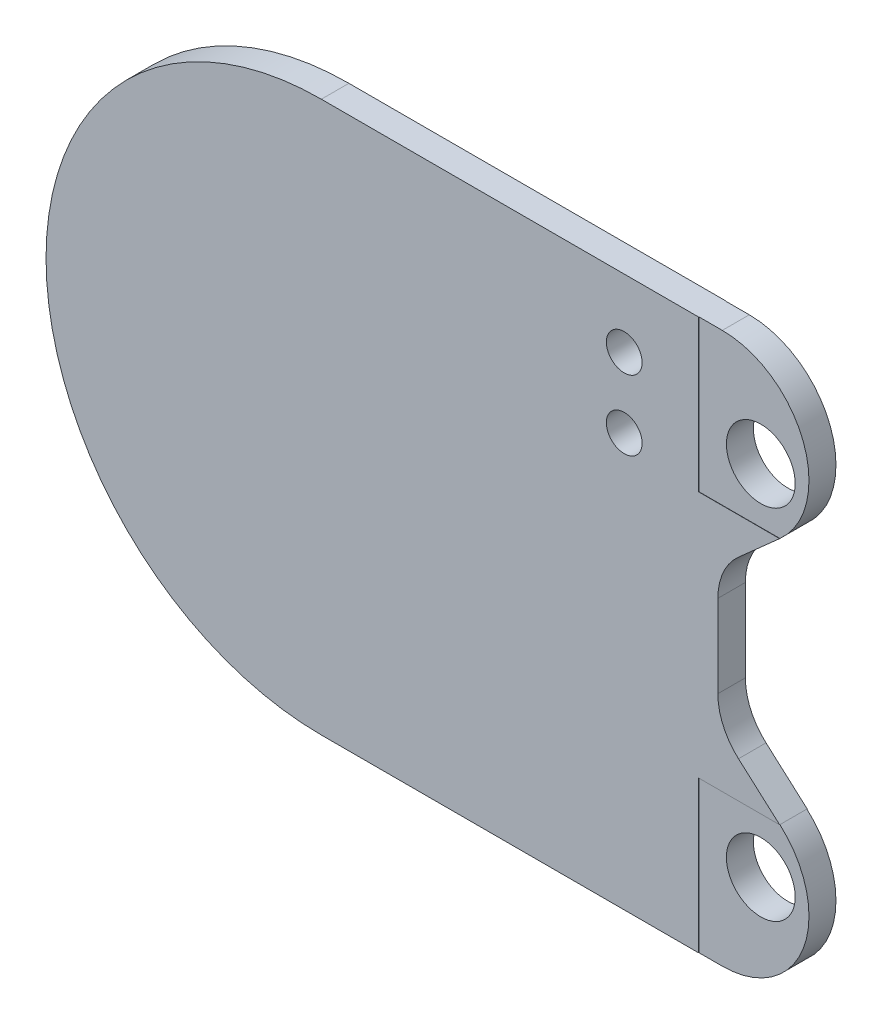
ISO-10303-21;
HEADER;
FILE_DESCRIPTION(('STEP AP214'),'2;1');
FILE_NAME('part.step','',(''),(''),'','','');
FILE_SCHEMA(('AUTOMOTIVE_DESIGN { 1 0 10303 214 1 1 1 1 }'));
ENDSEC;
DATA;
#1=APPLICATION_CONTEXT('core data for automotive mechanical design processes');
#2=APPLICATION_PROTOCOL_DEFINITION('international standard','automotive_design',2000,#1);
#3=PRODUCT_CONTEXT('',#1,'mechanical');
#4=PRODUCT('Part','Part','',(#3));
#5=PRODUCT_RELATED_PRODUCT_CATEGORY('part','',(#4));
#6=PRODUCT_DEFINITION_FORMATION('','',#4);
#7=PRODUCT_DEFINITION_CONTEXT('part definition',#1,'design');
#8=PRODUCT_DEFINITION('design','',#6,#7);
#9=PRODUCT_DEFINITION_SHAPE('','',#8);
#10=(LENGTH_UNIT() NAMED_UNIT(*) SI_UNIT(.MILLI.,.METRE.));
#11=(NAMED_UNIT(*) PLANE_ANGLE_UNIT() SI_UNIT($,.RADIAN.));
#12=(NAMED_UNIT(*) SI_UNIT($,.STERADIAN.) SOLID_ANGLE_UNIT());
#13=UNCERTAINTY_MEASURE_WITH_UNIT(LENGTH_MEASURE(1.E-05),#10,'distance_accuracy_value','');
#14=(GEOMETRIC_REPRESENTATION_CONTEXT(3) GLOBAL_UNCERTAINTY_ASSIGNED_CONTEXT((#13)) GLOBAL_UNIT_ASSIGNED_CONTEXT((#10,
#11,#12)) REPRESENTATION_CONTEXT('',''));
#15=CARTESIAN_POINT('',(0.,0.,0.));
#16=DIRECTION('',(0.,0.,1.));
#17=DIRECTION('',(1.,0.,0.));
#18=AXIS2_PLACEMENT_3D('',#15,#16,#17);
#19=CARTESIAN_POINT('',(15.95,-6.5,0.));
#20=DIRECTION('',(0.,0.,-1.));
#21=DIRECTION('',(1.,0.,0.));
#22=AXIS2_PLACEMENT_3D('',#19,#20,#21);
#23=CYLINDRICAL_SURFACE('',#22,1.25);
#24=CARTESIAN_POINT('',(15.95,-6.5,0.99));
#25=DIRECTION('',(0.,0.,1.));
#26=DIRECTION('',(1.,0.,0.));
#27=AXIS2_PLACEMENT_3D('',#24,#25,#26);
#28=CIRCLE('',#27,1.25);
#29=CARTESIAN_POINT('',(17.2,-6.5,0.99));
#30=VERTEX_POINT('',#29);
#31=EDGE_CURVE('E161',#30,#30,#28,.T.);
#32=ORIENTED_EDGE('',*,*,#31,.T.);
#33=DIRECTION('',(0.,0.,1.));
#34=VECTOR('',#33,1.);
#35=CARTESIAN_POINT('',(17.2,-6.5,0.));
#36=LINE('',#35,#34);
#37=CARTESIAN_POINT('',(17.2,-6.5,0.01));
#38=VERTEX_POINT('',#37);
#39=EDGE_CURVE('E11',#38,#30,#36,.T.);
#40=ORIENTED_EDGE('',*,*,#39,.F.);
#41=CARTESIAN_POINT('',(15.95,-6.5,0.01));
#42=DIRECTION('',(0.,0.,1.));
#43=DIRECTION('',(1.,0.,0.));
#44=AXIS2_PLACEMENT_3D('',#41,#42,#43);
#45=CIRCLE('',#44,1.25);
#46=EDGE_CURVE('E157',#38,#38,#45,.T.);
#47=ORIENTED_EDGE('',*,*,#46,.F.);
#48=ORIENTED_EDGE('',*,*,#39,.T.);
#49=EDGE_LOOP('',(#32,#40,#47,#48));
#50=FACE_BOUND('',#49,.T.);
#51=ADVANCED_FACE('F17',(#50),#23,.F.);
#52=CARTESIAN_POINT('',(15.95,6.5,0.));
#53=DIRECTION('',(0.,0.,-1.));
#54=DIRECTION('',(1.,0.,0.));
#55=AXIS2_PLACEMENT_3D('',#52,#53,#54);
#56=CYLINDRICAL_SURFACE('',#55,1.25);
#57=DIRECTION('',(0.,0.,1.));
#58=VECTOR('',#57,1.);
#59=CARTESIAN_POINT('',(17.2,6.5,0.));
#60=LINE('',#59,#58);
#61=CARTESIAN_POINT('',(17.2,6.5,0.01));
#62=VERTEX_POINT('',#61);
#63=CARTESIAN_POINT('',(17.2,6.5,0.99));
#64=VERTEX_POINT('',#63);
#65=EDGE_CURVE('E27',#62,#64,#60,.T.);
#66=ORIENTED_EDGE('',*,*,#65,.F.);
#67=CARTESIAN_POINT('',(15.95,6.5,0.01));
#68=DIRECTION('',(0.,0.,-1.));
#69=DIRECTION('',(1.,0.,0.));
#70=AXIS2_PLACEMENT_3D('',#67,#68,#69);
#71=CIRCLE('',#70,1.25);
#72=EDGE_CURVE('E447',#62,#62,#71,.T.);
#73=ORIENTED_EDGE('',*,*,#72,.T.);
#74=ORIENTED_EDGE('',*,*,#65,.T.);
#75=CARTESIAN_POINT('',(15.95,6.5,0.99));
#76=DIRECTION('',(0.,0.,-1.));
#77=DIRECTION('',(1.,0.,0.));
#78=AXIS2_PLACEMENT_3D('',#75,#76,#77);
#79=CIRCLE('',#78,1.25);
#80=EDGE_CURVE('E180',#64,#64,#79,.T.);
#81=ORIENTED_EDGE('',*,*,#80,.F.);
#82=EDGE_LOOP('',(#66,#73,#74,#81));
#83=FACE_BOUND('',#82,.T.);
#84=ADVANCED_FACE('F459',(#83),#56,.F.);
#85=CARTESIAN_POINT('',(13.7,-4.5,1.));
#86=DIRECTION('',(0.,1.,0.));
#87=DIRECTION('',(1.,0.,0.));
#88=AXIS2_PLACEMENT_3D('',#85,#86,#87);
#89=PLANE('',#88);
#90=DIRECTION('',(0.,0.,-1.));
#91=VECTOR('',#90,1.);
#92=CARTESIAN_POINT('',(13.7,-4.5,1.));
#93=LINE('',#92,#91);
#94=CARTESIAN_POINT('',(13.7,-4.5,1.));
#95=VERTEX_POINT('',#94);
#96=CARTESIAN_POINT('',(13.7,-4.5,0.99));
#97=VERTEX_POINT('',#96);
#98=EDGE_CURVE('E184',#95,#97,#93,.T.);
#99=ORIENTED_EDGE('',*,*,#98,.T.);
#100=DIRECTION('',(1.,0.,0.));
#101=VECTOR('',#100,1.);
#102=CARTESIAN_POINT('',(13.7,-4.5,0.99));
#103=LINE('',#102,#101);
#104=CARTESIAN_POINT('',(16.644268859701,-4.5,0.99));
#105=VERTEX_POINT('',#104);
#106=EDGE_CURVE('E181',#97,#105,#103,.T.);
#107=ORIENTED_EDGE('',*,*,#106,.T.);
#108=DIRECTION('',(0.,0.,1.));
#109=VECTOR('',#108,1.);
#110=CARTESIAN_POINT('',(16.644268859701,-4.5,0.));
#111=LINE('',#110,#109);
#112=CARTESIAN_POINT('',(16.644268859701,-4.5,1.));
#113=VERTEX_POINT('',#112);
#114=EDGE_CURVE('E414',#105,#113,#111,.T.);
#115=ORIENTED_EDGE('',*,*,#114,.T.);
#116=DIRECTION('',(1.,0.,0.));
#117=VECTOR('',#116,1.);
#118=CARTESIAN_POINT('',(13.7,-4.5,1.));
#119=LINE('',#118,#117);
#120=EDGE_CURVE('E441',#95,#113,#119,.T.);
#121=ORIENTED_EDGE('',*,*,#120,.F.);
#122=EDGE_LOOP('',(#99,#107,#115,#121));
#123=FACE_BOUND('',#122,.T.);
#124=ADVANCED_FACE('F496',(#123),#89,.F.);
#125=CARTESIAN_POINT('',(13.7,-4.5,1.));
#126=DIRECTION('',(1.,0.,0.));
#127=DIRECTION('',(0.,1.,0.));
#128=AXIS2_PLACEMENT_3D('',#125,#126,#127);
#129=PLANE('',#128);
#130=DIRECTION('',(0.,-1.,0.));
#131=VECTOR('',#130,1.);
#132=CARTESIAN_POINT('',(13.7,-4.5,1.));
#133=LINE('',#132,#131);
#134=CARTESIAN_POINT('',(13.7,-10.,1.));
#135=VERTEX_POINT('',#134);
#136=EDGE_CURVE('E442',#95,#135,#133,.T.);
#137=ORIENTED_EDGE('',*,*,#136,.T.);
#138=DIRECTION('',(0.,0.,-1.));
#139=VECTOR('',#138,1.);
#140=CARTESIAN_POINT('',(13.7,-10.,1.));
#141=LINE('',#140,#139);
#142=CARTESIAN_POINT('',(13.7,-10.,0.99));
#143=VERTEX_POINT('',#142);
#144=EDGE_CURVE('E279',#135,#143,#141,.T.);
#145=ORIENTED_EDGE('',*,*,#144,.T.);
#146=DIRECTION('',(0.,-1.,0.));
#147=VECTOR('',#146,1.);
#148=CARTESIAN_POINT('',(13.7,-4.5,0.99));
#149=LINE('',#148,#147);
#150=EDGE_CURVE('E174',#97,#143,#149,.T.);
#151=ORIENTED_EDGE('',*,*,#150,.F.);
#152=ORIENTED_EDGE('',*,*,#98,.F.);
#153=EDGE_LOOP('',(#137,#145,#151,#152));
#154=FACE_BOUND('',#153,.T.);
#155=ADVANCED_FACE('F500',(#154),#129,.T.);
#156=CARTESIAN_POINT('',(15.491587508688,-6.926194163271,0.99));
#157=DIRECTION('',(0.,0.,1.));
#158=DIRECTION('',(1.,0.,0.));
#159=AXIS2_PLACEMENT_3D('',#156,#157,#158);
#160=PLANE('',#159);
#161=ORIENTED_EDGE('',*,*,#31,.F.);
#162=EDGE_LOOP('',(#161));
#163=FACE_BOUND('',#162,.T.);
#164=ORIENTED_EDGE('',*,*,#150,.T.);
#165=DIRECTION('',(1.,0.,0.));
#166=VECTOR('',#165,1.);
#167=CARTESIAN_POINT('',(13.7,-10.,0.99));
#168=LINE('',#167,#166);
#169=CARTESIAN_POINT('',(14.552060306267,-10.,0.99));
#170=VERTEX_POINT('',#169);
#171=EDGE_CURVE('E388',#143,#170,#168,.T.);
#172=ORIENTED_EDGE('',*,*,#171,.T.);
#173=CARTESIAN_POINT('',(14.552060306267,-6.852060306267,0.99));
#174=DIRECTION('',(0.,0.,1.));
#175=DIRECTION('',(1.,0.,0.));
#176=AXIS2_PLACEMENT_3D('',#173,#174,#175);
#177=CIRCLE('',#176,3.147939693733);
#178=EDGE_CURVE('E167',#170,#105,#177,.T.);
#179=ORIENTED_EDGE('',*,*,#178,.T.);
#180=ORIENTED_EDGE('',*,*,#106,.F.);
#181=EDGE_LOOP('',(#164,#172,#179,#180));
#182=FACE_BOUND('',#181,.T.);
#183=ADVANCED_FACE('F515',(#163,#182),#160,.T.);
#184=CARTESIAN_POINT('',(14.552060306267,-6.852060306267,0.));
#185=DIRECTION('',(0.,0.,-1.));
#186=DIRECTION('',(1.,0.,0.));
#187=AXIS2_PLACEMENT_3D('',#184,#185,#186);
#188=CYLINDRICAL_SURFACE('',#187,3.147939693733);
#189=DIRECTION('',(0.,0.,1.));
#190=VECTOR('',#189,1.);
#191=CARTESIAN_POINT('',(14.552060306267,-10.,0.));
#192=LINE('',#191,#190);
#193=CARTESIAN_POINT('',(14.552060306267,-10.,0.01));
#194=VERTEX_POINT('',#193);
#195=EDGE_CURVE('E387',#194,#170,#192,.T.);
#196=ORIENTED_EDGE('',*,*,#195,.F.);
#197=CARTESIAN_POINT('',(14.552060306267,-6.852060306267,0.01));
#198=DIRECTION('',(0.,0.,1.));
#199=DIRECTION('',(1.,0.,0.));
#200=AXIS2_PLACEMENT_3D('',#197,#198,#199);
#201=CIRCLE('',#200,3.147939693733);
#202=CARTESIAN_POINT('',(16.644268859701,-4.5,0.01));
#203=VERTEX_POINT('',#202);
#204=EDGE_CURVE('E170',#194,#203,#201,.T.);
#205=ORIENTED_EDGE('',*,*,#204,.T.);
#206=DIRECTION('',(0.,0.,1.));
#207=VECTOR('',#206,1.);
#208=CARTESIAN_POINT('',(16.644268859701,-4.5,0.));
#209=LINE('',#208,#207);
#210=EDGE_CURVE('E312',#203,#105,#209,.T.);
#211=ORIENTED_EDGE('',*,*,#210,.T.);
#212=ORIENTED_EDGE('',*,*,#178,.F.);
#213=EDGE_LOOP('',(#196,#205,#211,#212));
#214=FACE_BOUND('',#213,.T.);
#215=ADVANCED_FACE('F512',(#214),#188,.T.);
#216=CARTESIAN_POINT('',(8.317731850928,-4.360470593991,0.01));
#217=DIRECTION('',(0.,0.,1.));
#218=DIRECTION('',(1.,0.,0.));
#219=AXIS2_PLACEMENT_3D('',#216,#217,#218);
#220=PLANE('',#219);
#221=ORIENTED_EDGE('',*,*,#46,.T.);
#222=EDGE_LOOP('',(#221));
#223=FACE_BOUND('',#222,.T.);
#224=DIRECTION('',(1.,0.,0.));
#225=VECTOR('',#224,1.);
#226=CARTESIAN_POINT('',(13.7,-4.5,0.01));
#227=LINE('',#226,#225);
#228=CARTESIAN_POINT('',(13.7,-4.5,0.01));
#229=VERTEX_POINT('',#228);
#230=EDGE_CURVE('E403',#229,#203,#227,.T.);
#231=ORIENTED_EDGE('',*,*,#230,.T.);
#232=ORIENTED_EDGE('',*,*,#204,.F.);
#233=DIRECTION('',(1.,0.,0.));
#234=VECTOR('',#233,1.);
#235=CARTESIAN_POINT('',(13.7,-10.,0.01));
#236=LINE('',#235,#234);
#237=CARTESIAN_POINT('',(13.7,-10.,0.01));
#238=VERTEX_POINT('',#237);
#239=EDGE_CURVE('E322',#238,#194,#236,.T.);
#240=ORIENTED_EDGE('',*,*,#239,.F.);
#241=DIRECTION('',(0.,-1.,0.));
#242=VECTOR('',#241,1.);
#243=CARTESIAN_POINT('',(13.7,-4.5,0.01));
#244=LINE('',#243,#242);
#245=EDGE_CURVE('E289',#229,#238,#244,.T.);
#246=ORIENTED_EDGE('',*,*,#245,.F.);
#247=EDGE_LOOP('',(#231,#232,#240,#246));
#248=FACE_BOUND('',#247,.T.);
#249=ADVANCED_FACE('F162',(#223,#248),#220,.F.);
#250=CARTESIAN_POINT('',(13.7,4.5,1.));
#251=DIRECTION('',(1.,0.,0.));
#252=DIRECTION('',(0.,1.,0.));
#253=AXIS2_PLACEMENT_3D('',#250,#251,#252);
#254=PLANE('',#253);
#255=DIRECTION('',(0.,0.,-1.));
#256=VECTOR('',#255,1.);
#257=CARTESIAN_POINT('',(13.7,4.5,1.));
#258=LINE('',#257,#256);
#259=CARTESIAN_POINT('',(13.7,4.5,1.));
#260=VERTEX_POINT('',#259);
#261=CARTESIAN_POINT('',(13.7,4.5,0.99));
#262=VERTEX_POINT('',#261);
#263=EDGE_CURVE('E234',#260,#262,#258,.T.);
#264=ORIENTED_EDGE('',*,*,#263,.T.);
#265=DIRECTION('',(0.,1.,0.));
#266=VECTOR('',#265,1.);
#267=CARTESIAN_POINT('',(13.7,4.5,0.99));
#268=LINE('',#267,#266);
#269=CARTESIAN_POINT('',(13.7,10.,0.99));
#270=VERTEX_POINT('',#269);
#271=EDGE_CURVE('E448',#262,#270,#268,.T.);
#272=ORIENTED_EDGE('',*,*,#271,.T.);
#273=DIRECTION('',(0.,0.,-1.));
#274=VECTOR('',#273,1.);
#275=CARTESIAN_POINT('',(13.7,10.,1.));
#276=LINE('',#275,#274);
#277=CARTESIAN_POINT('',(13.7,10.,1.));
#278=VERTEX_POINT('',#277);
#279=EDGE_CURVE('E258',#278,#270,#276,.T.);
#280=ORIENTED_EDGE('',*,*,#279,.F.);
#281=DIRECTION('',(0.,1.,0.));
#282=VECTOR('',#281,1.);
#283=CARTESIAN_POINT('',(13.7,4.5,1.));
#284=LINE('',#283,#282);
#285=EDGE_CURVE('E440',#260,#278,#284,.T.);
#286=ORIENTED_EDGE('',*,*,#285,.F.);
#287=EDGE_LOOP('',(#264,#272,#280,#286));
#288=FACE_BOUND('',#287,.T.);
#289=ADVANCED_FACE('F592',(#288),#254,.T.);
#290=CARTESIAN_POINT('',(15.491587508688,6.926194163271,0.99));
#291=DIRECTION('',(0.,0.,1.));
#292=DIRECTION('',(1.,0.,0.));
#293=AXIS2_PLACEMENT_3D('',#290,#291,#292);
#294=PLANE('',#293);
#295=ORIENTED_EDGE('',*,*,#80,.T.);
#296=EDGE_LOOP('',(#295));
#297=FACE_BOUND('',#296,.T.);
#298=DIRECTION('',(1.,0.,0.));
#299=VECTOR('',#298,1.);
#300=CARTESIAN_POINT('',(13.7,4.5,0.99));
#301=LINE('',#300,#299);
#302=CARTESIAN_POINT('',(16.644268859701,4.5,0.99));
#303=VERTEX_POINT('',#302);
#304=EDGE_CURVE('E228',#262,#303,#301,.T.);
#305=ORIENTED_EDGE('',*,*,#304,.T.);
#306=CARTESIAN_POINT('',(14.552060306267,6.852060306267,0.99));
#307=DIRECTION('',(0.,0.,-1.));
#308=DIRECTION('',(1.,0.,0.));
#309=AXIS2_PLACEMENT_3D('',#306,#307,#308);
#310=CIRCLE('',#309,3.147939693733);
#311=CARTESIAN_POINT('',(14.552060306267,10.,0.99));
#312=VERTEX_POINT('',#311);
#313=EDGE_CURVE('E351',#312,#303,#310,.T.);
#314=ORIENTED_EDGE('',*,*,#313,.F.);
#315=DIRECTION('',(1.,0.,0.));
#316=VECTOR('',#315,1.);
#317=CARTESIAN_POINT('',(13.7,10.,0.99));
#318=LINE('',#317,#316);
#319=EDGE_CURVE('E363',#270,#312,#318,.T.);
#320=ORIENTED_EDGE('',*,*,#319,.F.);
#321=ORIENTED_EDGE('',*,*,#271,.F.);
#322=EDGE_LOOP('',(#305,#314,#320,#321));
#323=FACE_BOUND('',#322,.T.);
#324=ADVANCED_FACE('F458',(#297,#323),#294,.T.);
#325=CARTESIAN_POINT('',(8.317731850928,4.360470593991,0.01));
#326=DIRECTION('',(0.,0.,1.));
#327=DIRECTION('',(1.,0.,0.));
#328=AXIS2_PLACEMENT_3D('',#325,#326,#327);
#329=PLANE('',#328);
#330=ORIENTED_EDGE('',*,*,#72,.F.);
#331=EDGE_LOOP('',(#330));
#332=FACE_BOUND('',#331,.T.);
#333=DIRECTION('',(0.,1.,0.));
#334=VECTOR('',#333,1.);
#335=CARTESIAN_POINT('',(13.7,4.5,0.01));
#336=LINE('',#335,#334);
#337=CARTESIAN_POINT('',(13.7,4.5,0.01));
#338=VERTEX_POINT('',#337);
#339=CARTESIAN_POINT('',(13.7,10.,0.01));
#340=VERTEX_POINT('',#339);
#341=EDGE_CURVE('E346',#338,#340,#336,.T.);
#342=ORIENTED_EDGE('',*,*,#341,.T.);
#343=DIRECTION('',(1.,0.,0.));
#344=VECTOR('',#343,1.);
#345=CARTESIAN_POINT('',(13.7,10.,0.01));
#346=LINE('',#345,#344);
#347=CARTESIAN_POINT('',(14.552060306267,10.,0.01));
#348=VERTEX_POINT('',#347);
#349=EDGE_CURVE('E369',#340,#348,#346,.T.);
#350=ORIENTED_EDGE('',*,*,#349,.T.);
#351=CARTESIAN_POINT('',(14.552060306267,6.852060306267,0.01));
#352=DIRECTION('',(0.,0.,-1.));
#353=DIRECTION('',(1.,0.,0.));
#354=AXIS2_PLACEMENT_3D('',#351,#352,#353);
#355=CIRCLE('',#354,3.147939693733);
#356=CARTESIAN_POINT('',(16.644268859701,4.5,0.01));
#357=VERTEX_POINT('',#356);
#358=EDGE_CURVE('E348',#348,#357,#355,.T.);
#359=ORIENTED_EDGE('',*,*,#358,.T.);
#360=DIRECTION('',(1.,0.,0.));
#361=VECTOR('',#360,1.);
#362=CARTESIAN_POINT('',(13.7,4.5,0.01));
#363=LINE('',#362,#361);
#364=EDGE_CURVE('E338',#338,#357,#363,.T.);
#365=ORIENTED_EDGE('',*,*,#364,.F.);
#366=EDGE_LOOP('',(#342,#350,#359,#365));
#367=FACE_BOUND('',#366,.T.);
#368=ADVANCED_FACE('F462',(#332,#367),#329,.F.);
#369=CARTESIAN_POINT('',(4.989555182878,0.,1.));
#370=DIRECTION('',(0.,0.,1.));
#371=DIRECTION('',(1.,0.,0.));
#372=AXIS2_PLACEMENT_3D('',#369,#370,#371);
#373=PLANE('',#372);
#374=CARTESIAN_POINT('',(11.,7.54,1.));
#375=DIRECTION('',(0.,0.,-1.));
#376=DIRECTION('',(1.,0.,0.));
#377=AXIS2_PLACEMENT_3D('',#374,#375,#376);
#378=CIRCLE('',#377,0.65);
#379=CARTESIAN_POINT('',(11.65,7.54,1.));
#380=VERTEX_POINT('',#379);
#381=EDGE_CURVE('E435',#380,#380,#378,.T.);
#382=ORIENTED_EDGE('',*,*,#381,.T.);
#383=EDGE_LOOP('',(#382));
#384=FACE_BOUND('',#383,.T.);
#385=CARTESIAN_POINT('',(11.,5.,1.));
#386=DIRECTION('',(0.,0.,-1.));
#387=DIRECTION('',(1.,0.,0.));
#388=AXIS2_PLACEMENT_3D('',#385,#386,#387);
#389=CIRCLE('',#388,0.65);
#390=CARTESIAN_POINT('',(11.65,5.,1.));
#391=VERTEX_POINT('',#390);
#392=EDGE_CURVE('E428',#391,#391,#389,.T.);
#393=ORIENTED_EDGE('',*,*,#392,.T.);
#394=EDGE_LOOP('',(#393));
#395=FACE_BOUND('',#394,.T.);
#396=CARTESIAN_POINT('',(16.636082961103,1.5,1.));
#397=DIRECTION('',(0.,0.,1.));
#398=DIRECTION('',(1.,0.,0.));
#399=AXIS2_PLACEMENT_3D('',#396,#397,#398);
#400=CIRCLE('',#399,2.236082961103);
#401=CARTESIAN_POINT('',(15.14991983456,3.17074419653,1.));
#402=VERTEX_POINT('',#401);
#403=CARTESIAN_POINT('',(14.4,1.5,1.));
#404=VERTEX_POINT('',#403);
#405=EDGE_CURVE('E238',#402,#404,#400,.T.);
#406=ORIENTED_EDGE('',*,*,#405,.F.);
#407=DIRECTION('',(0.747174512570858,0.664627901734874,0.));
#408=VECTOR('',#407,1.);
#409=CARTESIAN_POINT('',(15.14991983456,3.17074419653,1.));
#410=LINE('',#409,#408);
#411=CARTESIAN_POINT('',(16.644268859701,4.5,1.));
#412=VERTEX_POINT('',#411);
#413=EDGE_CURVE('E317',#402,#412,#410,.T.);
#414=ORIENTED_EDGE('',*,*,#413,.T.);
#415=DIRECTION('',(1.,0.,0.));
#416=VECTOR('',#415,1.);
#417=CARTESIAN_POINT('',(13.7,4.5,1.));
#418=LINE('',#417,#416);
#419=EDGE_CURVE('E231',#260,#412,#418,.T.);
#420=ORIENTED_EDGE('',*,*,#419,.F.);
#421=ORIENTED_EDGE('',*,*,#285,.T.);
#422=DIRECTION('',(1.,0.,0.));
#423=VECTOR('',#422,1.);
#424=CARTESIAN_POINT('',(0.,10.,1.));
#425=LINE('',#424,#423);
#426=CARTESIAN_POINT('',(0.,10.,1.));
#427=VERTEX_POINT('',#426);
#428=EDGE_CURVE('E252',#427,#278,#425,.T.);
#429=ORIENTED_EDGE('',*,*,#428,.F.);
#430=CARTESIAN_POINT('',(0.,0.,1.));
#431=DIRECTION('',(0.,0.,1.));
#432=DIRECTION('',(1.,0.,0.));
#433=AXIS2_PLACEMENT_3D('',#430,#431,#432);
#434=CIRCLE('',#433,10.);
#435=CARTESIAN_POINT('',(-10.,0.,1.));
#436=VERTEX_POINT('',#435);
#437=EDGE_CURVE('E380',#427,#436,#434,.T.);
#438=ORIENTED_EDGE('',*,*,#437,.T.);
#439=CARTESIAN_POINT('',(0.,0.,1.));
#440=DIRECTION('',(0.,0.,-1.));
#441=DIRECTION('',(1.,0.,0.));
#442=AXIS2_PLACEMENT_3D('',#439,#440,#441);
#443=CIRCLE('',#442,10.);
#444=CARTESIAN_POINT('',(0.,-10.,1.));
#445=VERTEX_POINT('',#444);
#446=EDGE_CURVE('E373',#445,#436,#443,.T.);
#447=ORIENTED_EDGE('',*,*,#446,.F.);
#448=DIRECTION('',(1.,0.,0.));
#449=VECTOR('',#448,1.);
#450=CARTESIAN_POINT('',(0.,-10.,1.));
#451=LINE('',#450,#449);
#452=EDGE_CURVE('E272',#445,#135,#451,.T.);
#453=ORIENTED_EDGE('',*,*,#452,.T.);
#454=ORIENTED_EDGE('',*,*,#136,.F.);
#455=ORIENTED_EDGE('',*,*,#120,.T.);
#456=DIRECTION('',(0.747174512570858,-0.664627901734874,0.));
#457=VECTOR('',#456,1.);
#458=CARTESIAN_POINT('',(15.14991983456,-3.17074419653,1.));
#459=LINE('',#458,#457);
#460=CARTESIAN_POINT('',(15.14991983456,-3.17074419653,1.));
#461=VERTEX_POINT('',#460);
#462=EDGE_CURVE('E411',#461,#113,#459,.T.);
#463=ORIENTED_EDGE('',*,*,#462,.F.);
#464=CARTESIAN_POINT('',(16.636082961103,-1.5,1.));
#465=DIRECTION('',(0.,0.,-1.));
#466=DIRECTION('',(1.,0.,0.));
#467=AXIS2_PLACEMENT_3D('',#464,#465,#466);
#468=CIRCLE('',#467,2.236082961103);
#469=CARTESIAN_POINT('',(14.4,-1.5,1.));
#470=VERTEX_POINT('',#469);
#471=EDGE_CURVE('E219',#461,#470,#468,.T.);
#472=ORIENTED_EDGE('',*,*,#471,.T.);
#473=DIRECTION('',(0.,1.,0.));
#474=VECTOR('',#473,1.);
#475=CARTESIAN_POINT('',(14.4,-1.5,1.));
#476=LINE('',#475,#474);
#477=EDGE_CURVE('E218',#470,#404,#476,.T.);
#478=ORIENTED_EDGE('',*,*,#477,.T.);
#479=EDGE_LOOP('',(#406,#414,#420,#421,#429,#438,#447,#453,#454,#455,#463,#472,#478));
#480=FACE_BOUND('',#479,.T.);
#481=ADVANCED_FACE('F466',(#384,#395,#480),#373,.T.);
#482=CARTESIAN_POINT('',(13.7,4.5,1.));
#483=DIRECTION('',(0.,-1.,0.));
#484=DIRECTION('',(0.,0.,-1.));
#485=AXIS2_PLACEMENT_3D('',#482,#483,#484);
#486=PLANE('',#485);
#487=ORIENTED_EDGE('',*,*,#419,.T.);
#488=DIRECTION('',(0.,0.,1.));
#489=VECTOR('',#488,1.);
#490=CARTESIAN_POINT('',(16.644268859701,4.5,0.));
#491=LINE('',#490,#489);
#492=EDGE_CURVE('E307',#303,#412,#491,.T.);
#493=ORIENTED_EDGE('',*,*,#492,.F.);
#494=ORIENTED_EDGE('',*,*,#304,.F.);
#495=ORIENTED_EDGE('',*,*,#263,.F.);
#496=EDGE_LOOP('',(#487,#493,#494,#495));
#497=FACE_BOUND('',#496,.T.);
#498=ADVANCED_FACE('F650',(#497),#486,.F.);
#499=CARTESIAN_POINT('',(14.552060306267,6.852060306267,0.));
#500=DIRECTION('',(0.,0.,-1.));
#501=DIRECTION('',(1.,0.,0.));
#502=AXIS2_PLACEMENT_3D('',#499,#500,#501);
#503=CYLINDRICAL_SURFACE('',#502,3.147939693733);
#504=ORIENTED_EDGE('',*,*,#313,.T.);
#505=DIRECTION('',(0.,0.,1.));
#506=VECTOR('',#505,1.);
#507=CARTESIAN_POINT('',(16.644268859701,4.5,0.));
#508=LINE('',#507,#506);
#509=EDGE_CURVE('E303',#357,#303,#508,.T.);
#510=ORIENTED_EDGE('',*,*,#509,.F.);
#511=ORIENTED_EDGE('',*,*,#358,.F.);
#512=DIRECTION('',(0.,0.,1.));
#513=VECTOR('',#512,1.);
#514=CARTESIAN_POINT('',(14.552060306267,10.,0.));
#515=LINE('',#514,#513);
#516=EDGE_CURVE('E364',#348,#312,#515,.T.);
#517=ORIENTED_EDGE('',*,*,#516,.T.);
#518=EDGE_LOOP('',(#504,#510,#511,#517));
#519=FACE_BOUND('',#518,.T.);
#520=ADVANCED_FACE('F644',(#519),#503,.T.);
#521=CARTESIAN_POINT('',(11.,7.54,0.));
#522=DIRECTION('',(0.,0.,-1.));
#523=DIRECTION('',(1.,0.,0.));
#524=AXIS2_PLACEMENT_3D('',#521,#522,#523);
#525=CYLINDRICAL_SURFACE('',#524,0.65);
#526=CARTESIAN_POINT('',(11.,7.54,0.));
#527=DIRECTION('',(0.,0.,1.));
#528=DIRECTION('',(1.,0.,0.));
#529=AXIS2_PLACEMENT_3D('',#526,#527,#528);
#530=CIRCLE('',#529,0.65);
#531=CARTESIAN_POINT('',(11.65,7.54,0.));
#532=VERTEX_POINT('',#531);
#533=EDGE_CURVE('E294',#532,#532,#530,.T.);
#534=ORIENTED_EDGE('',*,*,#533,.F.);
#535=DIRECTION('',(0.,0.,1.));
#536=VECTOR('',#535,1.);
#537=CARTESIAN_POINT('',(11.65,7.54,0.));
#538=LINE('',#537,#536);
#539=EDGE_CURVE('E431',#532,#380,#538,.T.);
#540=ORIENTED_EDGE('',*,*,#539,.T.);
#541=ORIENTED_EDGE('',*,*,#381,.F.);
#542=ORIENTED_EDGE('',*,*,#539,.F.);
#543=EDGE_LOOP('',(#534,#540,#541,#542));
#544=FACE_BOUND('',#543,.T.);
#545=ADVANCED_FACE('F667',(#544),#525,.F.);
#546=CARTESIAN_POINT('',(11.,5.,0.));
#547=DIRECTION('',(0.,0.,-1.));
#548=DIRECTION('',(1.,0.,0.));
#549=AXIS2_PLACEMENT_3D('',#546,#547,#548);
#550=CYLINDRICAL_SURFACE('',#549,0.65);
#551=CARTESIAN_POINT('',(11.,5.,0.));
#552=DIRECTION('',(0.,0.,1.));
#553=DIRECTION('',(1.,0.,0.));
#554=AXIS2_PLACEMENT_3D('',#551,#552,#553);
#555=CIRCLE('',#554,0.65);
#556=CARTESIAN_POINT('',(11.65,5.,0.));
#557=VERTEX_POINT('',#556);
#558=EDGE_CURVE('E290',#557,#557,#555,.T.);
#559=ORIENTED_EDGE('',*,*,#558,.F.);
#560=DIRECTION('',(0.,0.,1.));
#561=VECTOR('',#560,1.);
#562=CARTESIAN_POINT('',(11.65,5.,0.));
#563=LINE('',#562,#561);
#564=EDGE_CURVE('E241',#557,#391,#563,.T.);
#565=ORIENTED_EDGE('',*,*,#564,.T.);
#566=ORIENTED_EDGE('',*,*,#392,.F.);
#567=ORIENTED_EDGE('',*,*,#564,.F.);
#568=EDGE_LOOP('',(#559,#565,#566,#567));
#569=FACE_BOUND('',#568,.T.);
#570=ADVANCED_FACE('F657',(#569),#550,.F.);
#571=CARTESIAN_POINT('',(16.636082961103,1.5,0.));
#572=DIRECTION('',(0.,0.,-1.));
#573=DIRECTION('',(1.,0.,0.));
#574=AXIS2_PLACEMENT_3D('',#571,#572,#573);
#575=CYLINDRICAL_SURFACE('',#574,2.236082961103);
#576=DIRECTION('',(0.,0.,1.));
#577=VECTOR('',#576,1.);
#578=CARTESIAN_POINT('',(15.14991983456,3.17074419653,0.));
#579=LINE('',#578,#577);
#580=CARTESIAN_POINT('',(15.14991983456,3.17074419653,0.));
#581=VERTEX_POINT('',#580);
#582=EDGE_CURVE('E328',#581,#402,#579,.T.);
#583=ORIENTED_EDGE('',*,*,#582,.T.);
#584=ORIENTED_EDGE('',*,*,#405,.T.);
#585=DIRECTION('',(0.,0.,1.));
#586=VECTOR('',#585,1.);
#587=CARTESIAN_POINT('',(14.4,1.5,0.));
#588=LINE('',#587,#586);
#589=CARTESIAN_POINT('',(14.4,1.5,0.));
#590=VERTEX_POINT('',#589);
#591=EDGE_CURVE('E214',#590,#404,#588,.T.);
#592=ORIENTED_EDGE('',*,*,#591,.F.);
#593=CARTESIAN_POINT('',(16.636082961103,1.5,0.));
#594=DIRECTION('',(0.,0.,1.));
#595=DIRECTION('',(1.,0.,0.));
#596=AXIS2_PLACEMENT_3D('',#593,#594,#595);
#597=CIRCLE('',#596,2.236082961103);
#598=EDGE_CURVE('E221',#581,#590,#597,.T.);
#599=ORIENTED_EDGE('',*,*,#598,.F.);
#600=EDGE_LOOP('',(#583,#584,#592,#599));
#601=FACE_BOUND('',#600,.T.);
#602=ADVANCED_FACE('F656',(#601),#575,.F.);
#603=CARTESIAN_POINT('',(14.4,0.,0.5));
#604=DIRECTION('',(1.,0.,0.));
#605=DIRECTION('',(0.,1.,0.));
#606=AXIS2_PLACEMENT_3D('',#603,#604,#605);
#607=PLANE('',#606);
#608=ORIENTED_EDGE('',*,*,#591,.T.);
#609=ORIENTED_EDGE('',*,*,#477,.F.);
#610=DIRECTION('',(0.,0.,1.));
#611=VECTOR('',#610,1.);
#612=CARTESIAN_POINT('',(14.4,-1.5,0.));
#613=LINE('',#612,#611);
#614=CARTESIAN_POINT('',(14.4,-1.5,0.));
#615=VERTEX_POINT('',#614);
#616=EDGE_CURVE('E313',#615,#470,#613,.T.);
#617=ORIENTED_EDGE('',*,*,#616,.F.);
#618=DIRECTION('',(0.,-1.,0.));
#619=VECTOR('',#618,1.);
#620=CARTESIAN_POINT('',(14.4,1.5,0.));
#621=LINE('',#620,#619);
#622=EDGE_CURVE('E229',#590,#615,#621,.T.);
#623=ORIENTED_EDGE('',*,*,#622,.F.);
#624=EDGE_LOOP('',(#608,#609,#617,#623));
#625=FACE_BOUND('',#624,.T.);
#626=ADVANCED_FACE('F526',(#625),#607,.T.);
#627=CARTESIAN_POINT('',(16.636082961103,-1.5,0.));
#628=DIRECTION('',(0.,0.,-1.));
#629=DIRECTION('',(1.,0.,0.));
#630=AXIS2_PLACEMENT_3D('',#627,#628,#629);
#631=CYLINDRICAL_SURFACE('',#630,2.236082961103);
#632=CARTESIAN_POINT('',(16.636082961103,-1.5,0.));
#633=DIRECTION('',(0.,0.,-1.));
#634=DIRECTION('',(1.,0.,0.));
#635=AXIS2_PLACEMENT_3D('',#632,#633,#634);
#636=CIRCLE('',#635,2.236082961103);
#637=CARTESIAN_POINT('',(15.14991983456,-3.17074419653,0.));
#638=VERTEX_POINT('',#637);
#639=EDGE_CURVE('E204',#638,#615,#636,.T.);
#640=ORIENTED_EDGE('',*,*,#639,.T.);
#641=ORIENTED_EDGE('',*,*,#616,.T.);
#642=ORIENTED_EDGE('',*,*,#471,.F.);
#643=DIRECTION('',(0.,0.,1.));
#644=VECTOR('',#643,1.);
#645=CARTESIAN_POINT('',(15.14991983456,-3.17074419653,0.));
#646=LINE('',#645,#644);
#647=EDGE_CURVE('E406',#638,#461,#646,.T.);
#648=ORIENTED_EDGE('',*,*,#647,.F.);
#649=EDGE_LOOP('',(#640,#641,#642,#648));
#650=FACE_BOUND('',#649,.T.);
#651=ADVANCED_FACE('F523',(#650),#631,.F.);
#652=CARTESIAN_POINT('',(15.14991983456,-3.17074419653,0.));
#653=DIRECTION('',(-0.664627901734874,-0.747174512570858,0.));
#654=DIRECTION('',(-0.747174512570858,0.664627901734874,0.));
#655=AXIS2_PLACEMENT_3D('',#652,#653,#654);
#656=PLANE('',#655);
#657=ORIENTED_EDGE('',*,*,#647,.T.);
#658=ORIENTED_EDGE('',*,*,#462,.T.);
#659=ORIENTED_EDGE('',*,*,#114,.F.);
#660=ORIENTED_EDGE('',*,*,#210,.F.);
#661=DIRECTION('',(0.,0.,1.));
#662=VECTOR('',#661,1.);
#663=CARTESIAN_POINT('',(16.644268859701,-4.5,0.));
#664=LINE('',#663,#662);
#665=CARTESIAN_POINT('',(16.644268859701,-4.5,0.));
#666=VERTEX_POINT('',#665);
#667=EDGE_CURVE('E295',#666,#203,#664,.T.);
#668=ORIENTED_EDGE('',*,*,#667,.F.);
#669=DIRECTION('',(0.747174512570858,-0.664627901734874,0.));
#670=VECTOR('',#669,1.);
#671=CARTESIAN_POINT('',(15.14991983456,-3.17074419653,0.));
#672=LINE('',#671,#670);
#673=EDGE_CURVE('E248',#638,#666,#672,.T.);
#674=ORIENTED_EDGE('',*,*,#673,.F.);
#675=EDGE_LOOP('',(#657,#658,#659,#660,#668,#674));
#676=FACE_BOUND('',#675,.T.);
#677=ADVANCED_FACE('F520',(#676),#656,.F.);
#678=CARTESIAN_POINT('',(13.7,-4.5,0.));
#679=DIRECTION('',(0.,-1.,0.));
#680=DIRECTION('',(0.,0.,-1.));
#681=AXIS2_PLACEMENT_3D('',#678,#679,#680);
#682=PLANE('',#681);
#683=DIRECTION('',(1.,0.,0.));
#684=VECTOR('',#683,1.);
#685=CARTESIAN_POINT('',(13.7,-4.5,0.));
#686=LINE('',#685,#684);
#687=CARTESIAN_POINT('',(13.7,-4.5,0.));
#688=VERTEX_POINT('',#687);
#689=EDGE_CURVE('E250',#688,#666,#686,.T.);
#690=ORIENTED_EDGE('',*,*,#689,.T.);
#691=ORIENTED_EDGE('',*,*,#667,.T.);
#692=ORIENTED_EDGE('',*,*,#230,.F.);
#693=DIRECTION('',(0.,0.,1.));
#694=VECTOR('',#693,1.);
#695=CARTESIAN_POINT('',(13.7,-4.5,0.));
#696=LINE('',#695,#694);
#697=EDGE_CURVE('E280',#688,#229,#696,.T.);
#698=ORIENTED_EDGE('',*,*,#697,.F.);
#699=EDGE_LOOP('',(#690,#691,#692,#698));
#700=FACE_BOUND('',#699,.T.);
#701=ADVANCED_FACE('F604',(#700),#682,.T.);
#702=CARTESIAN_POINT('',(13.7,-4.5,0.));
#703=DIRECTION('',(-1.,0.,0.));
#704=DIRECTION('',(0.,0.,1.));
#705=AXIS2_PLACEMENT_3D('',#702,#703,#704);
#706=PLANE('',#705);
#707=ORIENTED_EDGE('',*,*,#697,.T.);
#708=ORIENTED_EDGE('',*,*,#245,.T.);
#709=DIRECTION('',(0.,0.,1.));
#710=VECTOR('',#709,1.);
#711=CARTESIAN_POINT('',(13.7,-10.,0.));
#712=LINE('',#711,#710);
#713=CARTESIAN_POINT('',(13.7,-10.,0.));
#714=VERTEX_POINT('',#713);
#715=EDGE_CURVE('E319',#714,#238,#712,.T.);
#716=ORIENTED_EDGE('',*,*,#715,.F.);
#717=DIRECTION('',(0.,-1.,0.));
#718=VECTOR('',#717,1.);
#719=CARTESIAN_POINT('',(13.7,-4.5,0.));
#720=LINE('',#719,#718);
#721=EDGE_CURVE('E245',#688,#714,#720,.T.);
#722=ORIENTED_EDGE('',*,*,#721,.F.);
#723=EDGE_LOOP('',(#707,#708,#716,#722));
#724=FACE_BOUND('',#723,.T.);
#725=ADVANCED_FACE('F706',(#724),#706,.F.);
#726=CARTESIAN_POINT('',(0.,-10.,0.));
#727=DIRECTION('',(0.,-1.,0.));
#728=DIRECTION('',(0.,0.,-1.));
#729=AXIS2_PLACEMENT_3D('',#726,#727,#728);
#730=PLANE('',#729);
#731=ORIENTED_EDGE('',*,*,#715,.T.);
#732=ORIENTED_EDGE('',*,*,#239,.T.);
#733=ORIENTED_EDGE('',*,*,#195,.T.);
#734=ORIENTED_EDGE('',*,*,#171,.F.);
#735=ORIENTED_EDGE('',*,*,#144,.F.);
#736=ORIENTED_EDGE('',*,*,#452,.F.);
#737=DIRECTION('',(0.,0.,1.));
#738=VECTOR('',#737,1.);
#739=CARTESIAN_POINT('',(0.,-10.,0.));
#740=LINE('',#739,#738);
#741=CARTESIAN_POINT('',(0.,-10.,0.));
#742=VERTEX_POINT('',#741);
#743=EDGE_CURVE('E324',#742,#445,#740,.T.);
#744=ORIENTED_EDGE('',*,*,#743,.F.);
#745=DIRECTION('',(1.,0.,0.));
#746=VECTOR('',#745,1.);
#747=CARTESIAN_POINT('',(0.,-10.,0.));
#748=LINE('',#747,#746);
#749=EDGE_CURVE('E246',#742,#714,#748,.T.);
#750=ORIENTED_EDGE('',*,*,#749,.T.);
#751=EDGE_LOOP('',(#731,#732,#733,#734,#735,#736,#744,#750));
#752=FACE_BOUND('',#751,.T.);
#753=ADVANCED_FACE('F509',(#752),#730,.T.);
#754=CARTESIAN_POINT('',(0.,0.,0.));
#755=DIRECTION('',(0.,0.,-1.));
#756=DIRECTION('',(1.,0.,0.));
#757=AXIS2_PLACEMENT_3D('',#754,#755,#756);
#758=CYLINDRICAL_SURFACE('',#757,10.);
#759=ORIENTED_EDGE('',*,*,#446,.T.);
#760=ORIENTED_EDGE('',*,*,#437,.F.);
#761=DIRECTION('',(0.,0.,1.));
#762=VECTOR('',#761,1.);
#763=CARTESIAN_POINT('',(0.,10.,0.));
#764=LINE('',#763,#762);
#765=CARTESIAN_POINT('',(0.,10.,0.));
#766=VERTEX_POINT('',#765);
#767=EDGE_CURVE('E260',#766,#427,#764,.T.);
#768=ORIENTED_EDGE('',*,*,#767,.F.);
#769=CARTESIAN_POINT('',(0.,0.,0.));
#770=DIRECTION('',(0.,0.,1.));
#771=DIRECTION('',(1.,0.,0.));
#772=AXIS2_PLACEMENT_3D('',#769,#770,#771);
#773=CIRCLE('',#772,10.);
#774=CARTESIAN_POINT('',(-10.,0.,0.));
#775=VERTEX_POINT('',#774);
#776=EDGE_CURVE('E264',#766,#775,#773,.T.);
#777=ORIENTED_EDGE('',*,*,#776,.T.);
#778=CARTESIAN_POINT('',(0.,0.,0.));
#779=DIRECTION('',(0.,0.,-1.));
#780=DIRECTION('',(1.,0.,0.));
#781=AXIS2_PLACEMENT_3D('',#778,#779,#780);
#782=CIRCLE('',#781,10.);
#783=EDGE_CURVE('E262',#742,#775,#782,.T.);
#784=ORIENTED_EDGE('',*,*,#783,.F.);
#785=ORIENTED_EDGE('',*,*,#743,.T.);
#786=EDGE_LOOP('',(#759,#760,#768,#777,#784,#785));
#787=FACE_BOUND('',#786,.T.);
#788=ADVANCED_FACE('F596',(#787),#758,.T.);
#789=CARTESIAN_POINT('',(0.,10.,0.));
#790=DIRECTION('',(0.,1.,0.));
#791=DIRECTION('',(1.,0.,0.));
#792=AXIS2_PLACEMENT_3D('',#789,#790,#791);
#793=PLANE('',#792);
#794=DIRECTION('',(1.,0.,0.));
#795=VECTOR('',#794,1.);
#796=CARTESIAN_POINT('',(0.,10.,0.));
#797=LINE('',#796,#795);
#798=CARTESIAN_POINT('',(13.7,10.,0.));
#799=VERTEX_POINT('',#798);
#800=EDGE_CURVE('E267',#766,#799,#797,.T.);
#801=ORIENTED_EDGE('',*,*,#800,.F.);
#802=ORIENTED_EDGE('',*,*,#767,.T.);
#803=ORIENTED_EDGE('',*,*,#428,.T.);
#804=ORIENTED_EDGE('',*,*,#279,.T.);
#805=ORIENTED_EDGE('',*,*,#319,.T.);
#806=ORIENTED_EDGE('',*,*,#516,.F.);
#807=ORIENTED_EDGE('',*,*,#349,.F.);
#808=DIRECTION('',(0.,0.,1.));
#809=VECTOR('',#808,1.);
#810=CARTESIAN_POINT('',(13.7,10.,0.));
#811=LINE('',#810,#809);
#812=EDGE_CURVE('E344',#799,#340,#811,.T.);
#813=ORIENTED_EDGE('',*,*,#812,.F.);
#814=EDGE_LOOP('',(#801,#802,#803,#804,#805,#806,#807,#813));
#815=FACE_BOUND('',#814,.T.);
#816=ADVANCED_FACE('F479',(#815),#793,.T.);
#817=CARTESIAN_POINT('',(13.7,4.5,0.));
#818=DIRECTION('',(-1.,0.,0.));
#819=DIRECTION('',(0.,0.,1.));
#820=AXIS2_PLACEMENT_3D('',#817,#818,#819);
#821=PLANE('',#820);
#822=DIRECTION('',(0.,1.,0.));
#823=VECTOR('',#822,1.);
#824=CARTESIAN_POINT('',(13.7,4.5,0.));
#825=LINE('',#824,#823);
#826=CARTESIAN_POINT('',(13.7,4.5,0.));
#827=VERTEX_POINT('',#826);
#828=EDGE_CURVE('E276',#827,#799,#825,.T.);
#829=ORIENTED_EDGE('',*,*,#828,.T.);
#830=ORIENTED_EDGE('',*,*,#812,.T.);
#831=ORIENTED_EDGE('',*,*,#341,.F.);
#832=DIRECTION('',(0.,0.,1.));
#833=VECTOR('',#832,1.);
#834=CARTESIAN_POINT('',(13.7,4.5,0.));
#835=LINE('',#834,#833);
#836=EDGE_CURVE('E333',#827,#338,#835,.T.);
#837=ORIENTED_EDGE('',*,*,#836,.F.);
#838=EDGE_LOOP('',(#829,#830,#831,#837));
#839=FACE_BOUND('',#838,.T.);
#840=ADVANCED_FACE('F471',(#839),#821,.F.);
#841=CARTESIAN_POINT('',(13.7,4.5,0.));
#842=DIRECTION('',(0.,1.,0.));
#843=DIRECTION('',(1.,0.,0.));
#844=AXIS2_PLACEMENT_3D('',#841,#842,#843);
#845=PLANE('',#844);
#846=ORIENTED_EDGE('',*,*,#836,.T.);
#847=ORIENTED_EDGE('',*,*,#364,.T.);
#848=DIRECTION('',(0.,0.,1.));
#849=VECTOR('',#848,1.);
#850=CARTESIAN_POINT('',(16.644268859701,4.5,0.));
#851=LINE('',#850,#849);
#852=CARTESIAN_POINT('',(16.644268859701,4.5,0.));
#853=VERTEX_POINT('',#852);
#854=EDGE_CURVE('E298',#853,#357,#851,.T.);
#855=ORIENTED_EDGE('',*,*,#854,.F.);
#856=DIRECTION('',(1.,0.,0.));
#857=VECTOR('',#856,1.);
#858=CARTESIAN_POINT('',(13.7,4.5,0.));
#859=LINE('',#858,#857);
#860=EDGE_CURVE('E284',#827,#853,#859,.T.);
#861=ORIENTED_EDGE('',*,*,#860,.F.);
#862=EDGE_LOOP('',(#846,#847,#855,#861));
#863=FACE_BOUND('',#862,.T.);
#864=ADVANCED_FACE('F653',(#863),#845,.T.);
#865=CARTESIAN_POINT('',(15.14991983456,3.17074419653,0.));
#866=DIRECTION('',(-0.664627901734874,0.747174512570858,0.));
#867=DIRECTION('',(0.,0.,1.));
#868=AXIS2_PLACEMENT_3D('',#865,#866,#867);
#869=PLANE('',#868);
#870=DIRECTION('',(0.747174512570858,0.664627901734874,0.));
#871=VECTOR('',#870,1.);
#872=CARTESIAN_POINT('',(15.14991983456,3.17074419653,0.));
#873=LINE('',#872,#871);
#874=EDGE_CURVE('E212',#581,#853,#873,.T.);
#875=ORIENTED_EDGE('',*,*,#874,.T.);
#876=ORIENTED_EDGE('',*,*,#854,.T.);
#877=ORIENTED_EDGE('',*,*,#509,.T.);
#878=ORIENTED_EDGE('',*,*,#492,.T.);
#879=ORIENTED_EDGE('',*,*,#413,.F.);
#880=ORIENTED_EDGE('',*,*,#582,.F.);
#881=EDGE_LOOP('',(#875,#876,#877,#878,#879,#880));
#882=FACE_BOUND('',#881,.T.);
#883=ADVANCED_FACE('F649',(#882),#869,.F.);
#884=CARTESIAN_POINT('',(4.989555182878,0.,0.));
#885=DIRECTION('',(0.,0.,-1.));
#886=DIRECTION('',(0.,-1.,0.));
#887=AXIS2_PLACEMENT_3D('',#884,#885,#886);
#888=PLANE('',#887);
#889=ORIENTED_EDGE('',*,*,#533,.T.);
#890=EDGE_LOOP('',(#889));
#891=FACE_BOUND('',#890,.T.);
#892=ORIENTED_EDGE('',*,*,#558,.T.);
#893=EDGE_LOOP('',(#892));
#894=FACE_BOUND('',#893,.T.);
#895=CARTESIAN_POINT('',(0.,0.,0.));
#896=DIRECTION('',(0.,0.,-1.));
#897=DIRECTION('',(1.,0.,0.));
#898=AXIS2_PLACEMENT_3D('',#895,#896,#897);
#899=CIRCLE('',#898,4.);
#900=CARTESIAN_POINT('',(-4.,0.,0.));
#901=VERTEX_POINT('',#900);
#902=CARTESIAN_POINT('',(4.,0.,0.));
#903=VERTEX_POINT('',#902);
#904=EDGE_CURVE('E207',#901,#903,#899,.T.);
#905=ORIENTED_EDGE('',*,*,#904,.F.);
#906=CARTESIAN_POINT('',(0.,0.,0.));
#907=DIRECTION('',(0.,0.,1.));
#908=DIRECTION('',(1.,0.,0.));
#909=AXIS2_PLACEMENT_3D('',#906,#907,#908);
#910=CIRCLE('',#909,4.);
#911=EDGE_CURVE('E206',#901,#903,#910,.T.);
#912=ORIENTED_EDGE('',*,*,#911,.T.);
#913=EDGE_LOOP('',(#905,#912));
#914=FACE_BOUND('',#913,.T.);
#915=ORIENTED_EDGE('',*,*,#874,.F.);
#916=ORIENTED_EDGE('',*,*,#598,.T.);
#917=ORIENTED_EDGE('',*,*,#622,.T.);
#918=ORIENTED_EDGE('',*,*,#639,.F.);
#919=ORIENTED_EDGE('',*,*,#673,.T.);
#920=ORIENTED_EDGE('',*,*,#689,.F.);
#921=ORIENTED_EDGE('',*,*,#721,.T.);
#922=ORIENTED_EDGE('',*,*,#749,.F.);
#923=ORIENTED_EDGE('',*,*,#783,.T.);
#924=ORIENTED_EDGE('',*,*,#776,.F.);
#925=ORIENTED_EDGE('',*,*,#800,.T.);
#926=ORIENTED_EDGE('',*,*,#828,.F.);
#927=ORIENTED_EDGE('',*,*,#860,.T.);
#928=EDGE_LOOP('',(#915,#916,#917,#918,#919,#920,#921,#922,#923,#924,#925,#926,#927));
#929=FACE_BOUND('',#928,.T.);
#930=ADVANCED_FACE('F599',(#891,#894,#914,#929),#888,.T.);
#931=CARTESIAN_POINT('',(0.,0.,0.));
#932=DIRECTION('',(0.,0.,-1.));
#933=DIRECTION('',(1.,0.,0.));
#934=AXIS2_PLACEMENT_3D('',#931,#932,#933);
#935=CYLINDRICAL_SURFACE('',#934,4.);
#936=CARTESIAN_POINT('',(0.,0.,0.01));
#937=DIRECTION('',(0.,0.,1.));
#938=DIRECTION('',(1.,0.,0.));
#939=AXIS2_PLACEMENT_3D('',#936,#937,#938);
#940=CIRCLE('',#939,4.);
#941=CARTESIAN_POINT('',(-4.,0.,0.01));
#942=VERTEX_POINT('',#941);
#943=CARTESIAN_POINT('',(4.,0.,0.01));
#944=VERTEX_POINT('',#943);
#945=EDGE_CURVE('E614',#942,#944,#940,.T.);
#946=ORIENTED_EDGE('',*,*,#945,.T.);
#947=CARTESIAN_POINT('',(4.,0.,0.01));
#948=CARTESIAN_POINT('',(4.,0.,0.));
#949=(BOUNDED_CURVE() B_SPLINE_CURVE(1,(#947,#948),.UNSPECIFIED.,.F.,
.F.) B_SPLINE_CURVE_WITH_KNOTS((2,2),(-0.01,0.),
.UNSPECIFIED.) CURVE() GEOMETRIC_REPRESENTATION_ITEM() RATIONAL_B_SPLINE_CURVE((1.,1.)) REPRESENTATION_ITEM(''));
#950=EDGE_CURVE('E209',#944,#903,#949,.T.);
#951=ORIENTED_EDGE('',*,*,#950,.T.);
#952=ORIENTED_EDGE('',*,*,#911,.F.);
#953=ORIENTED_EDGE('',*,*,#904,.T.);
#954=ORIENTED_EDGE('',*,*,#950,.F.);
#955=CARTESIAN_POINT('',(0.,0.,0.01));
#956=DIRECTION('',(0.,0.,-1.));
#957=DIRECTION('',(1.,0.,0.));
#958=AXIS2_PLACEMENT_3D('',#955,#956,#957);
#959=CIRCLE('',#958,4.);
#960=EDGE_CURVE('E620',#942,#944,#959,.T.);
#961=ORIENTED_EDGE('',*,*,#960,.F.);
#962=EDGE_LOOP('',(#946,#951,#952,#953,#954,#961));
#963=FACE_BOUND('',#962,.T.);
#964=ADVANCED_FACE('F727',(#963),#935,.F.);
#965=CARTESIAN_POINT('',(0.,0.,0.01));
#966=DIRECTION('',(0.,0.,-1.));
#967=DIRECTION('',(0.,-1.,0.));
#968=AXIS2_PLACEMENT_3D('',#965,#966,#967);
#969=PLANE('',#968);
#970=ORIENTED_EDGE('',*,*,#960,.T.);
#971=ORIENTED_EDGE('',*,*,#945,.F.);
#972=EDGE_LOOP('',(#970,#971));
#973=FACE_BOUND('',#972,.T.);
#974=ADVANCED_FACE('F735',(#973),#969,.T.);
#975=CLOSED_SHELL('',(#51,#84,#124,#155,#183,#215,#249,#289,#324,#368,#481,#498,#520,#545,#570,
#602,#626,#651,#677,#701,#725,#753,#788,#816,#840,#864,#883,#930,#964,#974));
#976=MANIFOLD_SOLID_BREP('B1',#975);
#977=ADVANCED_BREP_SHAPE_REPRESENTATION('',(#18,#976),#14);
#978=SHAPE_DEFINITION_REPRESENTATION(#9,#977);
ENDSEC;
END-ISO-10303-21;
